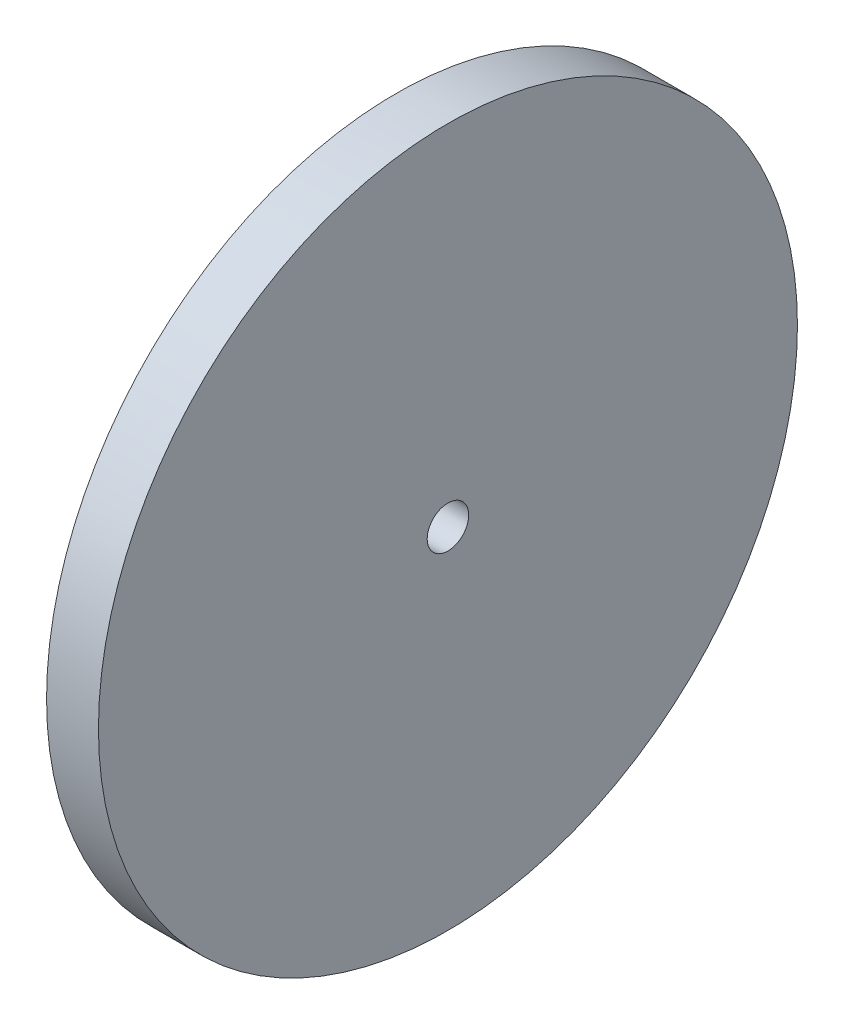
ISO-10303-21;
HEADER;
FILE_DESCRIPTION(('STEP AP214'),'2;1');
FILE_NAME('part.step','',(''),(''),'','','');
FILE_SCHEMA(('AUTOMOTIVE_DESIGN { 1 0 10303 214 1 1 1 1 }'));
ENDSEC;
DATA;
#1=APPLICATION_CONTEXT('core data for automotive mechanical design processes');
#2=APPLICATION_PROTOCOL_DEFINITION('international standard','automotive_design',2000,#1);
#3=PRODUCT_CONTEXT('',#1,'mechanical');
#4=PRODUCT('Part','Part','',(#3));
#5=PRODUCT_RELATED_PRODUCT_CATEGORY('part','',(#4));
#6=PRODUCT_DEFINITION_FORMATION('','',#4);
#7=PRODUCT_DEFINITION_CONTEXT('part definition',#1,'design');
#8=PRODUCT_DEFINITION('design','',#6,#7);
#9=PRODUCT_DEFINITION_SHAPE('','',#8);
#10=(LENGTH_UNIT() NAMED_UNIT(*) SI_UNIT(.MILLI.,.METRE.));
#11=(NAMED_UNIT(*) PLANE_ANGLE_UNIT() SI_UNIT($,.RADIAN.));
#12=(NAMED_UNIT(*) SI_UNIT($,.STERADIAN.) SOLID_ANGLE_UNIT());
#13=UNCERTAINTY_MEASURE_WITH_UNIT(LENGTH_MEASURE(1.E-05),#10,'distance_accuracy_value','');
#14=(GEOMETRIC_REPRESENTATION_CONTEXT(3) GLOBAL_UNCERTAINTY_ASSIGNED_CONTEXT((#13)) GLOBAL_UNIT_ASSIGNED_CONTEXT((#10,
#11,#12)) REPRESENTATION_CONTEXT('',''));
#15=CARTESIAN_POINT('',(0.,0.,0.));
#16=DIRECTION('',(0.,0.,1.));
#17=DIRECTION('',(1.,0.,0.));
#18=AXIS2_PLACEMENT_3D('',#15,#16,#17);
#19=CARTESIAN_POINT('',(-499.172,80.821,43.229));
#20=DIRECTION('',(1.,0.,0.));
#21=DIRECTION('',(0.,0.,-1.));
#22=AXIS2_PLACEMENT_3D('',#19,#20,#21);
#23=CYLINDRICAL_SURFACE('',#22,4.8);
#24=CARTESIAN_POINT('',(-499.172,80.821,43.229));
#25=DIRECTION('',(-1.,0.,0.));
#26=DIRECTION('',(0.,0.,1.));
#27=AXIS2_PLACEMENT_3D('',#24,#25,#26);
#28=CIRCLE('',#27,4.8);
#29=CARTESIAN_POINT('',(-499.172,80.821,48.029));
#30=VERTEX_POINT('',#29);
#31=EDGE_CURVE('E37',#30,#30,#28,.T.);
#32=ORIENTED_EDGE('',*,*,#31,.T.);
#33=EDGE_LOOP('',(#32));
#34=FACE_BOUND('',#33,.T.);
#35=CARTESIAN_POINT('',(-487.172,80.821,43.229));
#36=DIRECTION('',(-1.,0.,0.));
#37=DIRECTION('',(0.,0.,1.));
#38=AXIS2_PLACEMENT_3D('',#35,#36,#37);
#39=CIRCLE('',#38,4.8);
#40=CARTESIAN_POINT('',(-487.172,80.821,48.029));
#41=VERTEX_POINT('',#40);
#42=EDGE_CURVE('E45',#41,#41,#39,.F.);
#43=ORIENTED_EDGE('',*,*,#42,.T.);
#44=EDGE_LOOP('',(#43));
#45=FACE_BOUND('',#44,.T.);
#46=ADVANCED_FACE('F31',(#34,#45),#23,.F.);
#47=CARTESIAN_POINT('',(-499.172,80.821,43.229));
#48=DIRECTION('',(1.,0.,0.));
#49=DIRECTION('',(0.,0.,-1.));
#50=AXIS2_PLACEMENT_3D('',#47,#48,#49);
#51=CYLINDRICAL_SURFACE('',#50,80.821);
#52=CARTESIAN_POINT('',(-499.172,80.821,43.229));
#53=DIRECTION('',(-1.,0.,0.));
#54=DIRECTION('',(0.,0.,1.));
#55=AXIS2_PLACEMENT_3D('',#52,#53,#54);
#56=CIRCLE('',#55,80.821);
#57=CARTESIAN_POINT('',(-499.172,80.821,124.05));
#58=VERTEX_POINT('',#57);
#59=EDGE_CURVE('E10',#58,#58,#56,.T.);
#60=ORIENTED_EDGE('',*,*,#59,.F.);
#61=EDGE_LOOP('',(#60));
#62=FACE_BOUND('',#61,.T.);
#63=CARTESIAN_POINT('',(-487.172,80.821,43.229));
#64=DIRECTION('',(-1.,0.,0.));
#65=DIRECTION('',(0.,0.,1.));
#66=AXIS2_PLACEMENT_3D('',#63,#64,#65);
#67=CIRCLE('',#66,80.821);
#68=CARTESIAN_POINT('',(-487.172,80.821,124.05));
#69=VERTEX_POINT('',#68);
#70=EDGE_CURVE('E41',#69,#69,#67,.F.);
#71=ORIENTED_EDGE('',*,*,#70,.F.);
#72=EDGE_LOOP('',(#71));
#73=FACE_BOUND('',#72,.T.);
#74=ADVANCED_FACE('F60',(#62,#73),#51,.T.);
#75=CARTESIAN_POINT('',(-499.172,0.,0.));
#76=DIRECTION('',(-1.,0.,0.));
#77=DIRECTION('',(0.,0.,1.));
#78=AXIS2_PLACEMENT_3D('',#75,#76,#77);
#79=PLANE('',#78);
#80=ORIENTED_EDGE('',*,*,#31,.F.);
#81=EDGE_LOOP('',(#80));
#82=FACE_BOUND('',#81,.T.);
#83=ORIENTED_EDGE('',*,*,#59,.T.);
#84=EDGE_LOOP('',(#83));
#85=FACE_BOUND('',#84,.T.);
#86=ADVANCED_FACE('F54',(#82,#85),#79,.T.);
#87=CARTESIAN_POINT('',(-487.172,80.821,43.229));
#88=DIRECTION('',(-1.,0.,0.));
#89=DIRECTION('',(0.,0.,1.));
#90=AXIS2_PLACEMENT_3D('',#87,#88,#89);
#91=PLANE('',#90);
#92=ORIENTED_EDGE('',*,*,#70,.T.);
#93=EDGE_LOOP('',(#92));
#94=FACE_BOUND('',#93,.T.);
#95=ORIENTED_EDGE('',*,*,#42,.F.);
#96=EDGE_LOOP('',(#95));
#97=FACE_BOUND('',#96,.T.);
#98=ADVANCED_FACE('F52',(#94,#97),#91,.F.);
#99=CLOSED_SHELL('',(#46,#74,#86,#98));
#100=MANIFOLD_SOLID_BREP('B2',#99);
#101=ADVANCED_BREP_SHAPE_REPRESENTATION('',(#18,#100),#14);
#102=SHAPE_DEFINITION_REPRESENTATION(#9,#101);
ENDSEC;
END-ISO-10303-21;
